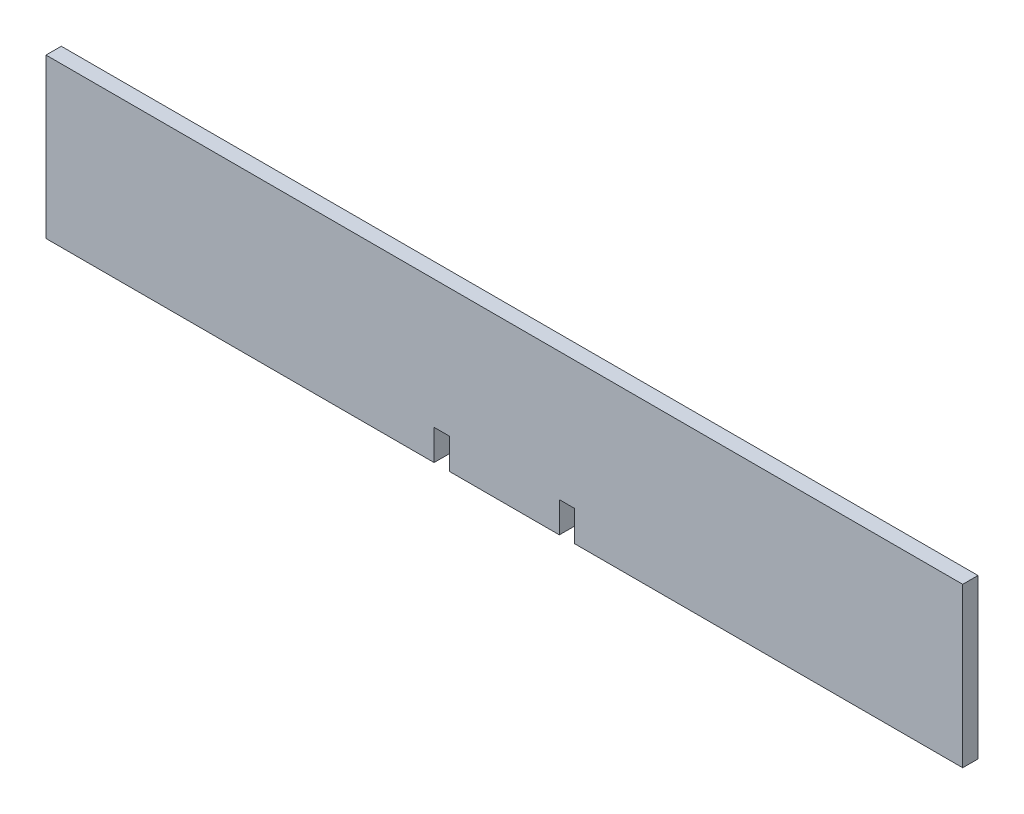
ISO-10303-21;
HEADER;
FILE_DESCRIPTION(('STEP AP214'),'2;1');
FILE_NAME('part.step','',(''),(''),'','','');
FILE_SCHEMA(('AUTOMOTIVE_DESIGN { 1 0 10303 214 1 1 1 1 }'));
ENDSEC;
DATA;
#1=APPLICATION_CONTEXT('core data for automotive mechanical design processes');
#2=APPLICATION_PROTOCOL_DEFINITION('international standard','automotive_design',2000,#1);
#3=PRODUCT_CONTEXT('',#1,'mechanical');
#4=PRODUCT('Part','Part','',(#3));
#5=PRODUCT_RELATED_PRODUCT_CATEGORY('part','',(#4));
#6=PRODUCT_DEFINITION_FORMATION('','',#4);
#7=PRODUCT_DEFINITION_CONTEXT('part definition',#1,'design');
#8=PRODUCT_DEFINITION('design','',#6,#7);
#9=PRODUCT_DEFINITION_SHAPE('','',#8);
#10=(LENGTH_UNIT() NAMED_UNIT(*) SI_UNIT(.MILLI.,.METRE.));
#11=(NAMED_UNIT(*) PLANE_ANGLE_UNIT() SI_UNIT($,.RADIAN.));
#12=(NAMED_UNIT(*) SI_UNIT($,.STERADIAN.) SOLID_ANGLE_UNIT());
#13=UNCERTAINTY_MEASURE_WITH_UNIT(LENGTH_MEASURE(1.E-05),#10,'distance_accuracy_value','');
#14=(GEOMETRIC_REPRESENTATION_CONTEXT(3) GLOBAL_UNCERTAINTY_ASSIGNED_CONTEXT((#13)) GLOBAL_UNIT_ASSIGNED_CONTEXT((#10,
#11,#12)) REPRESENTATION_CONTEXT('',''));
#15=CARTESIAN_POINT('',(0.,0.,0.));
#16=DIRECTION('',(0.,0.,1.));
#17=DIRECTION('',(1.,0.,0.));
#18=AXIS2_PLACEMENT_3D('',#15,#16,#17);
#19=CARTESIAN_POINT('',(0.,-16.,2.5));
#20=DIRECTION('',(0.,1.,0.));
#21=DIRECTION('',(0.,0.,1.));
#22=AXIS2_PLACEMENT_3D('',#19,#20,#21);
#23=PLANE('',#22);
#24=DIRECTION('',(1.,0.,0.));
#25=VECTOR('',#24,1.);
#26=CARTESIAN_POINT('',(0.,-16.,-2.5));
#27=LINE('',#26,#25);
#28=CARTESIAN_POINT('',(18.,-16.,-2.5));
#29=VERTEX_POINT('',#28);
#30=CARTESIAN_POINT('',(23.,-16.,-2.5));
#31=VERTEX_POINT('',#30);
#32=EDGE_CURVE('E215',#29,#31,#27,.T.);
#33=ORIENTED_EDGE('',*,*,#32,.T.);
#34=DIRECTION('',(0.,0.,-1.));
#35=VECTOR('',#34,1.);
#36=CARTESIAN_POINT('',(23.,-16.,2.5));
#37=LINE('',#36,#35);
#38=CARTESIAN_POINT('',(23.,-16.,2.5));
#39=VERTEX_POINT('',#38);
#40=EDGE_CURVE('E11',#39,#31,#37,.T.);
#41=ORIENTED_EDGE('',*,*,#40,.F.);
#42=DIRECTION('',(1.,0.,0.));
#43=VECTOR('',#42,1.);
#44=CARTESIAN_POINT('',(0.,-16.,2.5));
#45=LINE('',#44,#43);
#46=CARTESIAN_POINT('',(18.,-16.,2.5));
#47=VERTEX_POINT('',#46);
#48=EDGE_CURVE('E173',#47,#39,#45,.T.);
#49=ORIENTED_EDGE('',*,*,#48,.F.);
#50=DIRECTION('',(0.,0.,-1.));
#51=VECTOR('',#50,1.);
#52=CARTESIAN_POINT('',(18.,-16.,2.5));
#53=LINE('',#52,#51);
#54=EDGE_CURVE('E57',#47,#29,#53,.T.);
#55=ORIENTED_EDGE('',*,*,#54,.T.);
#56=EDGE_LOOP('',(#33,#41,#49,#55));
#57=FACE_BOUND('',#56,.T.);
#58=ADVANCED_FACE('F41',(#57),#23,.F.);
#59=CARTESIAN_POINT('',(23.,0.,2.5));
#60=DIRECTION('',(1.,0.,0.));
#61=DIRECTION('',(0.,1.,0.));
#62=AXIS2_PLACEMENT_3D('',#59,#60,#61);
#63=PLANE('',#62);
#64=DIRECTION('',(0.,-1.,0.));
#65=VECTOR('',#64,1.);
#66=CARTESIAN_POINT('',(23.,0.,-2.5));
#67=LINE('',#66,#65);
#68=CARTESIAN_POINT('',(23.,-26.,-2.5));
#69=VERTEX_POINT('',#68);
#70=EDGE_CURVE('E209',#31,#69,#67,.T.);
#71=ORIENTED_EDGE('',*,*,#70,.T.);
#72=DIRECTION('',(0.,0.,-1.));
#73=VECTOR('',#72,1.);
#74=CARTESIAN_POINT('',(23.,-26.,2.5));
#75=LINE('',#74,#73);
#76=CARTESIAN_POINT('',(23.,-26.,2.5));
#77=VERTEX_POINT('',#76);
#78=EDGE_CURVE('E49',#77,#69,#75,.T.);
#79=ORIENTED_EDGE('',*,*,#78,.F.);
#80=DIRECTION('',(0.,-1.,0.));
#81=VECTOR('',#80,1.);
#82=CARTESIAN_POINT('',(23.,0.,2.5));
#83=LINE('',#82,#81);
#84=EDGE_CURVE('E108',#39,#77,#83,.T.);
#85=ORIENTED_EDGE('',*,*,#84,.F.);
#86=ORIENTED_EDGE('',*,*,#40,.T.);
#87=EDGE_LOOP('',(#71,#79,#85,#86));
#88=FACE_BOUND('',#87,.T.);
#89=ADVANCED_FACE('F258',(#88),#63,.F.);
#90=CARTESIAN_POINT('',(0.,-26.,2.5));
#91=DIRECTION('',(0.,1.,0.));
#92=DIRECTION('',(0.,0.,1.));
#93=AXIS2_PLACEMENT_3D('',#90,#91,#92);
#94=PLANE('',#93);
#95=DIRECTION('',(1.,0.,0.));
#96=VECTOR('',#95,1.);
#97=CARTESIAN_POINT('',(0.,-26.,-2.5));
#98=LINE('',#97,#96);
#99=CARTESIAN_POINT('',(150.,-26.,-2.5));
#100=VERTEX_POINT('',#99);
#101=EDGE_CURVE('E183',#69,#100,#98,.T.);
#102=ORIENTED_EDGE('',*,*,#101,.T.);
#103=DIRECTION('',(0.,0.,-1.));
#104=VECTOR('',#103,1.);
#105=CARTESIAN_POINT('',(150.,-26.,2.5));
#106=LINE('',#105,#104);
#107=CARTESIAN_POINT('',(150.,-26.,2.5));
#108=VERTEX_POINT('',#107);
#109=EDGE_CURVE('E201',#108,#100,#106,.T.);
#110=ORIENTED_EDGE('',*,*,#109,.F.);
#111=DIRECTION('',(1.,0.,0.));
#112=VECTOR('',#111,1.);
#113=CARTESIAN_POINT('',(0.,-26.,2.5));
#114=LINE('',#113,#112);
#115=EDGE_CURVE('E161',#77,#108,#114,.T.);
#116=ORIENTED_EDGE('',*,*,#115,.F.);
#117=ORIENTED_EDGE('',*,*,#78,.T.);
#118=EDGE_LOOP('',(#102,#110,#116,#117));
#119=FACE_BOUND('',#118,.T.);
#120=ADVANCED_FACE('F206',(#119),#94,.F.);
#121=CARTESIAN_POINT('',(150.,0.,2.5));
#122=DIRECTION('',(1.,0.,0.));
#123=DIRECTION('',(0.,0.,-1.));
#124=AXIS2_PLACEMENT_3D('',#121,#122,#123);
#125=PLANE('',#124);
#126=DIRECTION('',(0.,-1.,0.));
#127=VECTOR('',#126,1.);
#128=CARTESIAN_POINT('',(150.,0.,-2.5));
#129=LINE('',#128,#127);
#130=CARTESIAN_POINT('',(150.,26.,-2.5));
#131=VERTEX_POINT('',#130);
#132=EDGE_CURVE('E212',#131,#100,#129,.T.);
#133=ORIENTED_EDGE('',*,*,#132,.F.);
#134=DIRECTION('',(0.,0.,-1.));
#135=VECTOR('',#134,1.);
#136=CARTESIAN_POINT('',(150.,26.,2.5));
#137=LINE('',#136,#135);
#138=CARTESIAN_POINT('',(150.,26.,2.5));
#139=VERTEX_POINT('',#138);
#140=EDGE_CURVE('E199',#139,#131,#137,.T.);
#141=ORIENTED_EDGE('',*,*,#140,.F.);
#142=DIRECTION('',(0.,-1.,0.));
#143=VECTOR('',#142,1.);
#144=CARTESIAN_POINT('',(150.,0.,2.5));
#145=LINE('',#144,#143);
#146=EDGE_CURVE('E167',#139,#108,#145,.T.);
#147=ORIENTED_EDGE('',*,*,#146,.T.);
#148=ORIENTED_EDGE('',*,*,#109,.T.);
#149=EDGE_LOOP('',(#133,#141,#147,#148));
#150=FACE_BOUND('',#149,.T.);
#151=ADVANCED_FACE('F253',(#150),#125,.T.);
#152=CARTESIAN_POINT('',(0.,26.,2.5));
#153=DIRECTION('',(0.,1.,0.));
#154=DIRECTION('',(-1.,0.,0.));
#155=AXIS2_PLACEMENT_3D('',#152,#153,#154);
#156=PLANE('',#155);
#157=DIRECTION('',(1.,0.,0.));
#158=VECTOR('',#157,1.);
#159=CARTESIAN_POINT('',(0.,26.,-2.5));
#160=LINE('',#159,#158);
#161=CARTESIAN_POINT('',(-150.,26.,-2.5));
#162=VERTEX_POINT('',#161);
#163=EDGE_CURVE('E213',#162,#131,#160,.T.);
#164=ORIENTED_EDGE('',*,*,#163,.F.);
#165=DIRECTION('',(0.,0.,-1.));
#166=VECTOR('',#165,1.);
#167=CARTESIAN_POINT('',(-150.,26.,2.5));
#168=LINE('',#167,#166);
#169=CARTESIAN_POINT('',(-150.,26.,2.5));
#170=VERTEX_POINT('',#169);
#171=EDGE_CURVE('E197',#170,#162,#168,.T.);
#172=ORIENTED_EDGE('',*,*,#171,.F.);
#173=DIRECTION('',(1.,0.,0.));
#174=VECTOR('',#173,1.);
#175=CARTESIAN_POINT('',(0.,26.,2.5));
#176=LINE('',#175,#174);
#177=EDGE_CURVE('E172',#170,#139,#176,.T.);
#178=ORIENTED_EDGE('',*,*,#177,.T.);
#179=ORIENTED_EDGE('',*,*,#140,.T.);
#180=EDGE_LOOP('',(#164,#172,#178,#179));
#181=FACE_BOUND('',#180,.T.);
#182=ADVANCED_FACE('F246',(#181),#156,.T.);
#183=CARTESIAN_POINT('',(-150.,0.,2.5));
#184=DIRECTION('',(1.,0.,0.));
#185=DIRECTION('',(0.,0.,-1.));
#186=AXIS2_PLACEMENT_3D('',#183,#184,#185);
#187=PLANE('',#186);
#188=DIRECTION('',(0.,-1.,0.));
#189=VECTOR('',#188,1.);
#190=CARTESIAN_POINT('',(-150.,0.,-2.5));
#191=LINE('',#190,#189);
#192=CARTESIAN_POINT('',(-150.,-26.,-2.5));
#193=VERTEX_POINT('',#192);
#194=EDGE_CURVE('E219',#162,#193,#191,.T.);
#195=ORIENTED_EDGE('',*,*,#194,.T.);
#196=DIRECTION('',(0.,0.,-1.));
#197=VECTOR('',#196,1.);
#198=CARTESIAN_POINT('',(-150.,-26.,2.5));
#199=LINE('',#198,#197);
#200=CARTESIAN_POINT('',(-150.,-26.,2.5));
#201=VERTEX_POINT('',#200);
#202=EDGE_CURVE('E194',#201,#193,#199,.T.);
#203=ORIENTED_EDGE('',*,*,#202,.F.);
#204=DIRECTION('',(0.,-1.,0.));
#205=VECTOR('',#204,1.);
#206=CARTESIAN_POINT('',(-150.,0.,2.5));
#207=LINE('',#206,#205);
#208=EDGE_CURVE('E166',#170,#201,#207,.T.);
#209=ORIENTED_EDGE('',*,*,#208,.F.);
#210=ORIENTED_EDGE('',*,*,#171,.T.);
#211=EDGE_LOOP('',(#195,#203,#209,#210));
#212=FACE_BOUND('',#211,.T.);
#213=ADVANCED_FACE('F244',(#212),#187,.F.);
#214=CARTESIAN_POINT('',(-23.,-26.,-2.5));
#215=VERTEX_POINT('',#214);
#216=EDGE_CURVE('E182',#193,#215,#98,.T.);
#217=ORIENTED_EDGE('',*,*,#216,.T.);
#218=DIRECTION('',(0.,0.,-1.));
#219=VECTOR('',#218,1.);
#220=CARTESIAN_POINT('',(-23.,-26.,2.5));
#221=LINE('',#220,#219);
#222=CARTESIAN_POINT('',(-23.,-26.,2.5));
#223=VERTEX_POINT('',#222);
#224=EDGE_CURVE('E192',#223,#215,#221,.T.);
#225=ORIENTED_EDGE('',*,*,#224,.F.);
#226=EDGE_CURVE('E160',#201,#223,#114,.T.);
#227=ORIENTED_EDGE('',*,*,#226,.F.);
#228=ORIENTED_EDGE('',*,*,#202,.T.);
#229=EDGE_LOOP('',(#217,#225,#227,#228));
#230=FACE_BOUND('',#229,.T.);
#231=ADVANCED_FACE('F239',(#230),#94,.F.);
#232=CARTESIAN_POINT('',(-23.,0.,2.5));
#233=DIRECTION('',(1.,0.,0.));
#234=DIRECTION('',(0.,1.,0.));
#235=AXIS2_PLACEMENT_3D('',#232,#233,#234);
#236=PLANE('',#235);
#237=DIRECTION('',(0.,-1.,0.));
#238=VECTOR('',#237,1.);
#239=CARTESIAN_POINT('',(-23.,0.,-2.5));
#240=LINE('',#239,#238);
#241=CARTESIAN_POINT('',(-23.,-16.,-2.5));
#242=VERTEX_POINT('',#241);
#243=EDGE_CURVE('E218',#242,#215,#240,.T.);
#244=ORIENTED_EDGE('',*,*,#243,.F.);
#245=DIRECTION('',(0.,0.,-1.));
#246=VECTOR('',#245,1.);
#247=CARTESIAN_POINT('',(-23.,-16.,2.5));
#248=LINE('',#247,#246);
#249=CARTESIAN_POINT('',(-23.,-16.,2.5));
#250=VERTEX_POINT('',#249);
#251=EDGE_CURVE('E190',#250,#242,#248,.T.);
#252=ORIENTED_EDGE('',*,*,#251,.F.);
#253=DIRECTION('',(0.,-1.,0.));
#254=VECTOR('',#253,1.);
#255=CARTESIAN_POINT('',(-23.,0.,2.5));
#256=LINE('',#255,#254);
#257=EDGE_CURVE('E165',#250,#223,#256,.T.);
#258=ORIENTED_EDGE('',*,*,#257,.T.);
#259=ORIENTED_EDGE('',*,*,#224,.T.);
#260=EDGE_LOOP('',(#244,#252,#258,#259));
#261=FACE_BOUND('',#260,.T.);
#262=ADVANCED_FACE('F236',(#261),#236,.T.);
#263=CARTESIAN_POINT('',(0.,-16.,2.5));
#264=DIRECTION('',(0.,1.,0.));
#265=DIRECTION('',(-1.,0.,0.));
#266=AXIS2_PLACEMENT_3D('',#263,#264,#265);
#267=PLANE('',#266);
#268=DIRECTION('',(1.,0.,0.));
#269=VECTOR('',#268,1.);
#270=CARTESIAN_POINT('',(0.,-16.,-2.5));
#271=LINE('',#270,#269);
#272=CARTESIAN_POINT('',(-18.,-16.,-2.5));
#273=VERTEX_POINT('',#272);
#274=EDGE_CURVE('E224',#242,#273,#271,.T.);
#275=ORIENTED_EDGE('',*,*,#274,.T.);
#276=DIRECTION('',(0.,0.,-1.));
#277=VECTOR('',#276,1.);
#278=CARTESIAN_POINT('',(-18.,-16.,2.5));
#279=LINE('',#278,#277);
#280=CARTESIAN_POINT('',(-18.,-16.,2.5));
#281=VERTEX_POINT('',#280);
#282=EDGE_CURVE('E155',#281,#273,#279,.T.);
#283=ORIENTED_EDGE('',*,*,#282,.F.);
#284=DIRECTION('',(1.,0.,0.));
#285=VECTOR('',#284,1.);
#286=CARTESIAN_POINT('',(0.,-16.,2.5));
#287=LINE('',#286,#285);
#288=EDGE_CURVE('E143',#250,#281,#287,.T.);
#289=ORIENTED_EDGE('',*,*,#288,.F.);
#290=ORIENTED_EDGE('',*,*,#251,.T.);
#291=EDGE_LOOP('',(#275,#283,#289,#290));
#292=FACE_BOUND('',#291,.T.);
#293=ADVANCED_FACE('F233',(#292),#267,.F.);
#294=CARTESIAN_POINT('',(-18.,0.,2.5));
#295=DIRECTION('',(1.,0.,0.));
#296=DIRECTION('',(0.,1.,0.));
#297=AXIS2_PLACEMENT_3D('',#294,#295,#296);
#298=PLANE('',#297);
#299=DIRECTION('',(0.,-1.,0.));
#300=VECTOR('',#299,1.);
#301=CARTESIAN_POINT('',(-18.,0.,-2.5));
#302=LINE('',#301,#300);
#303=CARTESIAN_POINT('',(-18.,-26.,-2.5));
#304=VERTEX_POINT('',#303);
#305=EDGE_CURVE('E152',#273,#304,#302,.T.);
#306=ORIENTED_EDGE('',*,*,#305,.T.);
#307=DIRECTION('',(0.,0.,-1.));
#308=VECTOR('',#307,1.);
#309=CARTESIAN_POINT('',(-18.,-26.,2.5));
#310=LINE('',#309,#308);
#311=CARTESIAN_POINT('',(-18.,-26.,2.5));
#312=VERTEX_POINT('',#311);
#313=EDGE_CURVE('E149',#312,#304,#310,.T.);
#314=ORIENTED_EDGE('',*,*,#313,.F.);
#315=DIRECTION('',(0.,-1.,0.));
#316=VECTOR('',#315,1.);
#317=CARTESIAN_POINT('',(-18.,0.,2.5));
#318=LINE('',#317,#316);
#319=EDGE_CURVE('E135',#281,#312,#318,.T.);
#320=ORIENTED_EDGE('',*,*,#319,.F.);
#321=ORIENTED_EDGE('',*,*,#282,.T.);
#322=EDGE_LOOP('',(#306,#314,#320,#321));
#323=FACE_BOUND('',#322,.T.);
#324=ADVANCED_FACE('F150',(#323),#298,.F.);
#325=CARTESIAN_POINT('',(18.,-26.,-2.5));
#326=VERTEX_POINT('',#325);
#327=EDGE_CURVE('E178',#304,#326,#98,.T.);
#328=ORIENTED_EDGE('',*,*,#327,.T.);
#329=DIRECTION('',(0.,0.,-1.));
#330=VECTOR('',#329,1.);
#331=CARTESIAN_POINT('',(18.,-26.,2.5));
#332=LINE('',#331,#330);
#333=CARTESIAN_POINT('',(18.,-26.,2.5));
#334=VERTEX_POINT('',#333);
#335=EDGE_CURVE('E96',#334,#326,#332,.T.);
#336=ORIENTED_EDGE('',*,*,#335,.F.);
#337=EDGE_CURVE('E140',#312,#334,#114,.T.);
#338=ORIENTED_EDGE('',*,*,#337,.F.);
#339=ORIENTED_EDGE('',*,*,#313,.T.);
#340=EDGE_LOOP('',(#328,#336,#338,#339));
#341=FACE_BOUND('',#340,.T.);
#342=ADVANCED_FACE('F157',(#341),#94,.F.);
#343=CARTESIAN_POINT('',(18.,0.,2.5));
#344=DIRECTION('',(1.,0.,0.));
#345=DIRECTION('',(0.,0.,-1.));
#346=AXIS2_PLACEMENT_3D('',#343,#344,#345);
#347=PLANE('',#346);
#348=DIRECTION('',(0.,-1.,0.));
#349=VECTOR('',#348,1.);
#350=CARTESIAN_POINT('',(18.,0.,-2.5));
#351=LINE('',#350,#349);
#352=EDGE_CURVE('E174',#29,#326,#351,.T.);
#353=ORIENTED_EDGE('',*,*,#352,.F.);
#354=ORIENTED_EDGE('',*,*,#54,.F.);
#355=DIRECTION('',(0.,-1.,0.));
#356=VECTOR('',#355,1.);
#357=CARTESIAN_POINT('',(18.,0.,2.5));
#358=LINE('',#357,#356);
#359=EDGE_CURVE('E158',#47,#334,#358,.T.);
#360=ORIENTED_EDGE('',*,*,#359,.T.);
#361=ORIENTED_EDGE('',*,*,#335,.T.);
#362=EDGE_LOOP('',(#353,#354,#360,#361));
#363=FACE_BOUND('',#362,.T.);
#364=ADVANCED_FACE('F278',(#363),#347,.T.);
#365=CARTESIAN_POINT('',(0.,0.,2.5));
#366=DIRECTION('',(0.,0.,1.));
#367=DIRECTION('',(1.,0.,0.));
#368=AXIS2_PLACEMENT_3D('',#365,#366,#367);
#369=PLANE('',#368);
#370=ORIENTED_EDGE('',*,*,#48,.T.);
#371=ORIENTED_EDGE('',*,*,#84,.T.);
#372=ORIENTED_EDGE('',*,*,#115,.T.);
#373=ORIENTED_EDGE('',*,*,#146,.F.);
#374=ORIENTED_EDGE('',*,*,#177,.F.);
#375=ORIENTED_EDGE('',*,*,#208,.T.);
#376=ORIENTED_EDGE('',*,*,#226,.T.);
#377=ORIENTED_EDGE('',*,*,#257,.F.);
#378=ORIENTED_EDGE('',*,*,#288,.T.);
#379=ORIENTED_EDGE('',*,*,#319,.T.);
#380=ORIENTED_EDGE('',*,*,#337,.T.);
#381=ORIENTED_EDGE('',*,*,#359,.F.);
#382=EDGE_LOOP('',(#370,#371,#372,#373,#374,#375,#376,#377,#378,#379,#380,#381));
#383=FACE_BOUND('',#382,.T.);
#384=ADVANCED_FACE('F137',(#383),#369,.T.);
#385=CARTESIAN_POINT('',(0.,0.,-2.5));
#386=DIRECTION('',(0.,0.,1.));
#387=DIRECTION('',(1.,0.,0.));
#388=AXIS2_PLACEMENT_3D('',#385,#386,#387);
#389=PLANE('',#388);
#390=ORIENTED_EDGE('',*,*,#32,.F.);
#391=ORIENTED_EDGE('',*,*,#352,.T.);
#392=ORIENTED_EDGE('',*,*,#327,.F.);
#393=ORIENTED_EDGE('',*,*,#305,.F.);
#394=ORIENTED_EDGE('',*,*,#274,.F.);
#395=ORIENTED_EDGE('',*,*,#243,.T.);
#396=ORIENTED_EDGE('',*,*,#216,.F.);
#397=ORIENTED_EDGE('',*,*,#194,.F.);
#398=ORIENTED_EDGE('',*,*,#163,.T.);
#399=ORIENTED_EDGE('',*,*,#132,.T.);
#400=ORIENTED_EDGE('',*,*,#101,.F.);
#401=ORIENTED_EDGE('',*,*,#70,.F.);
#402=EDGE_LOOP('',(#390,#391,#392,#393,#394,#395,#396,#397,#398,#399,#400,#401));
#403=FACE_BOUND('',#402,.T.);
#404=ADVANCED_FACE('F208',(#403),#389,.F.);
#405=CLOSED_SHELL('',(#58,#89,#120,#151,#182,#213,#231,#262,#293,#324,#342,#364,#384,#404));
#406=MANIFOLD_SOLID_BREP('B2',#405);
#407=ADVANCED_BREP_SHAPE_REPRESENTATION('',(#18,#406),#14);
#408=SHAPE_DEFINITION_REPRESENTATION(#9,#407);
ENDSEC;
END-ISO-10303-21;
